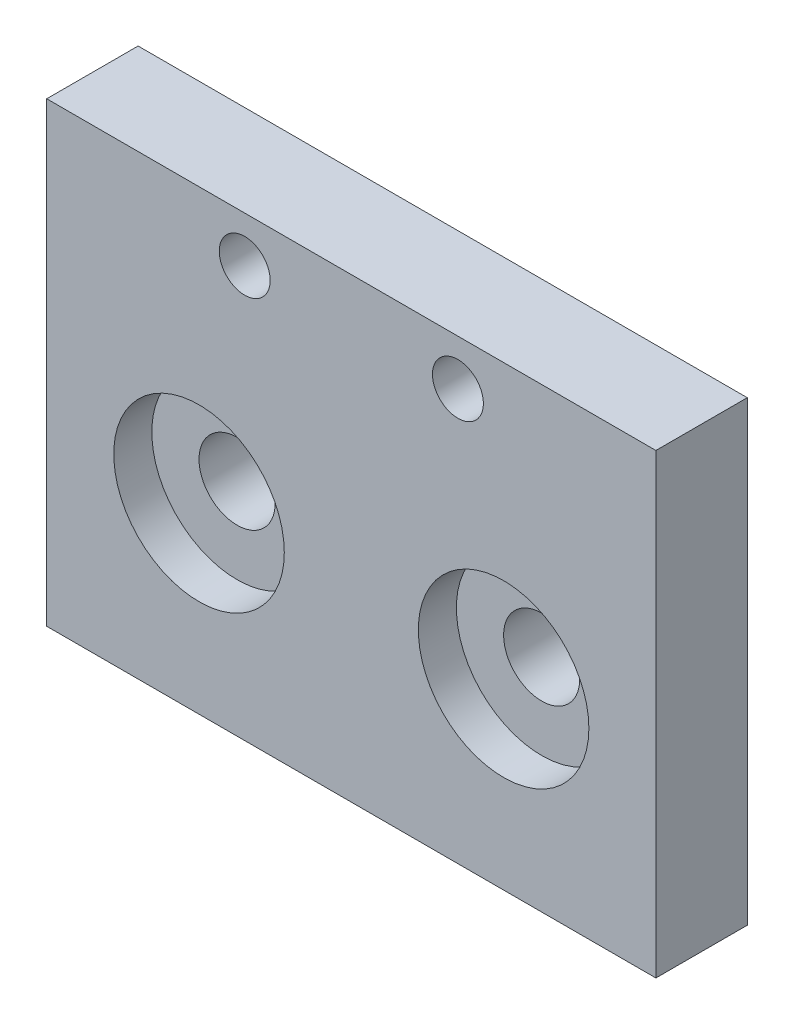
ISO-10303-21;
HEADER;
FILE_DESCRIPTION(('STEP AP214'),'2;1');
FILE_NAME('part.step','',(''),(''),'','','');
FILE_SCHEMA(('AUTOMOTIVE_DESIGN { 1 0 10303 214 1 1 1 1 }'));
ENDSEC;
DATA;
#1=APPLICATION_CONTEXT('core data for automotive mechanical design processes');
#2=APPLICATION_PROTOCOL_DEFINITION('international standard','automotive_design',2000,#1);
#3=PRODUCT_CONTEXT('',#1,'mechanical');
#4=PRODUCT('Part','Part','',(#3));
#5=PRODUCT_RELATED_PRODUCT_CATEGORY('part','',(#4));
#6=PRODUCT_DEFINITION_FORMATION('','',#4);
#7=PRODUCT_DEFINITION_CONTEXT('part definition',#1,'design');
#8=PRODUCT_DEFINITION('design','',#6,#7);
#9=PRODUCT_DEFINITION_SHAPE('','',#8);
#10=(LENGTH_UNIT() NAMED_UNIT(*) SI_UNIT(.MILLI.,.METRE.));
#11=(NAMED_UNIT(*) PLANE_ANGLE_UNIT() SI_UNIT($,.RADIAN.));
#12=(NAMED_UNIT(*) SI_UNIT($,.STERADIAN.) SOLID_ANGLE_UNIT());
#13=UNCERTAINTY_MEASURE_WITH_UNIT(LENGTH_MEASURE(1.E-05),#10,'distance_accuracy_value','');
#14=(GEOMETRIC_REPRESENTATION_CONTEXT(3) GLOBAL_UNCERTAINTY_ASSIGNED_CONTEXT((#13)) GLOBAL_UNIT_ASSIGNED_CONTEXT((#10,
#11,#12)) REPRESENTATION_CONTEXT('',''));
#15=CARTESIAN_POINT('',(0.,0.,0.));
#16=DIRECTION('',(0.,0.,1.));
#17=DIRECTION('',(1.,0.,0.));
#18=AXIS2_PLACEMENT_3D('',#15,#16,#17);
#19=CARTESIAN_POINT('',(15.875,-28.575,9.525));
#20=DIRECTION('',(0.,0.,-1.));
#21=DIRECTION('',(-1.,0.,0.));
#22=AXIS2_PLACEMENT_3D('',#19,#20,#21);
#23=CYLINDRICAL_SURFACE('',#22,3.96874999999999);
#24=CARTESIAN_POINT('',(15.875,-28.575,0.));
#25=DIRECTION('',(0.,0.,1.));
#26=DIRECTION('',(1.,0.,0.));
#27=AXIS2_PLACEMENT_3D('',#24,#25,#26);
#28=CIRCLE('',#27,3.96874999999999);
#29=CARTESIAN_POINT('',(11.90625,-28.575,0.));
#30=VERTEX_POINT('',#29);
#31=EDGE_CURVE('E150',#30,#30,#28,.F.);
#32=CARTESIAN_POINT('',(15.875,-28.575,5.55752));
#33=DIRECTION('',(0.,0.,1.));
#34=DIRECTION('',(1.,0.,0.));
#35=AXIS2_PLACEMENT_3D('',#32,#33,#34);
#36=CIRCLE('',#35,3.96874999999999);
#37=CARTESIAN_POINT('',(11.90625,-28.575,5.55752));
#38=VERTEX_POINT('',#37);
#39=EDGE_CURVE('E170',#38,#38,#36,.F.);
#40=CARTESIAN_POINT('',(11.90625,-28.575,0.));
#41=CARTESIAN_POINT('',(11.90625,-28.575,0.0578908333333332));
#42=CARTESIAN_POINT('',(11.90625,-28.575,0.115781666666666));
#43=CARTESIAN_POINT('',(11.90625,-28.575,0.231563333333333));
#44=CARTESIAN_POINT('',(11.90625,-28.575,0.289454166666667));
#45=CARTESIAN_POINT('',(11.90625,-28.575,0.405235833333334));
#46=CARTESIAN_POINT('',(11.90625,-28.575,0.463126666666667));
#47=CARTESIAN_POINT('',(11.90625,-28.575,0.578908333333333));
#48=CARTESIAN_POINT('',(11.90625,-28.575,0.636799166666666));
#49=CARTESIAN_POINT('',(11.90625,-28.575,0.752580833333333));
#50=CARTESIAN_POINT('',(11.90625,-28.575,0.810471666666667));
#51=CARTESIAN_POINT('',(11.90625,-28.575,0.926253333333334));
#52=CARTESIAN_POINT('',(11.90625,-28.575,0.984144166666667));
#53=CARTESIAN_POINT('',(11.90625,-28.575,1.09992583333333));
#54=CARTESIAN_POINT('',(11.90625,-28.575,1.15781666666667));
#55=CARTESIAN_POINT('',(11.90625,-28.575,1.27359833333333));
#56=CARTESIAN_POINT('',(11.90625,-28.575,1.33148916666667));
#57=CARTESIAN_POINT('',(11.90625,-28.575,1.44727083333333));
#58=CARTESIAN_POINT('',(11.90625,-28.575,1.50516166666667));
#59=CARTESIAN_POINT('',(11.90625,-28.575,1.62094333333333));
#60=CARTESIAN_POINT('',(11.90625,-28.575,1.67883416666667));
#61=CARTESIAN_POINT('',(11.90625,-28.575,1.79461583333333));
#62=CARTESIAN_POINT('',(11.90625,-28.575,1.85250666666667));
#63=CARTESIAN_POINT('',(11.90625,-28.575,1.96828833333333));
#64=CARTESIAN_POINT('',(11.90625,-28.575,2.02617916666667));
#65=CARTESIAN_POINT('',(11.90625,-28.575,2.14196083333333));
#66=CARTESIAN_POINT('',(11.90625,-28.575,2.19985166666667));
#67=CARTESIAN_POINT('',(11.90625,-28.575,2.31563333333333));
#68=CARTESIAN_POINT('',(11.90625,-28.575,2.37352416666667));
#69=CARTESIAN_POINT('',(11.90625,-28.575,2.48930583333333));
#70=CARTESIAN_POINT('',(11.90625,-28.575,2.54719666666667));
#71=CARTESIAN_POINT('',(11.90625,-28.575,2.66297833333333));
#72=CARTESIAN_POINT('',(11.90625,-28.575,2.72086916666667));
#73=CARTESIAN_POINT('',(11.90625,-28.575,2.83665083333333));
#74=CARTESIAN_POINT('',(11.90625,-28.575,2.89454166666667));
#75=CARTESIAN_POINT('',(11.90625,-28.575,3.01032333333333));
#76=CARTESIAN_POINT('',(11.90625,-28.575,3.06821416666667));
#77=CARTESIAN_POINT('',(11.90625,-28.575,3.18399583333333));
#78=CARTESIAN_POINT('',(11.90625,-28.575,3.24188666666667));
#79=CARTESIAN_POINT('',(11.90625,-28.575,3.35766833333333));
#80=CARTESIAN_POINT('',(11.90625,-28.575,3.41555916666667));
#81=CARTESIAN_POINT('',(11.90625,-28.575,3.53134083333333));
#82=CARTESIAN_POINT('',(11.90625,-28.575,3.58923166666667));
#83=CARTESIAN_POINT('',(11.90625,-28.575,3.70501333333333));
#84=CARTESIAN_POINT('',(11.90625,-28.575,3.76290416666667));
#85=CARTESIAN_POINT('',(11.90625,-28.575,3.87868583333333));
#86=CARTESIAN_POINT('',(11.90625,-28.575,3.93657666666667));
#87=CARTESIAN_POINT('',(11.90625,-28.575,4.05235833333333));
#88=CARTESIAN_POINT('',(11.90625,-28.575,4.11024916666667));
#89=CARTESIAN_POINT('',(11.90625,-28.575,4.22603083333333));
#90=CARTESIAN_POINT('',(11.90625,-28.575,4.28392166666667));
#91=CARTESIAN_POINT('',(11.90625,-28.575,4.39970333333333));
#92=CARTESIAN_POINT('',(11.90625,-28.575,4.45759416666667));
#93=CARTESIAN_POINT('',(11.90625,-28.575,4.57337583333333));
#94=CARTESIAN_POINT('',(11.90625,-28.575,4.63126666666667));
#95=CARTESIAN_POINT('',(11.90625,-28.575,4.74704833333333));
#96=CARTESIAN_POINT('',(11.90625,-28.575,4.80493916666667));
#97=CARTESIAN_POINT('',(11.90625,-28.575,4.92072083333333));
#98=CARTESIAN_POINT('',(11.90625,-28.575,4.97861166666667));
#99=CARTESIAN_POINT('',(11.90625,-28.575,5.09439333333333));
#100=CARTESIAN_POINT('',(11.90625,-28.575,5.15228416666667));
#101=CARTESIAN_POINT('',(11.90625,-28.575,5.26806583333333));
#102=CARTESIAN_POINT('',(11.90625,-28.575,5.32595666666667));
#103=CARTESIAN_POINT('',(11.90625,-28.575,5.44173833333333));
#104=CARTESIAN_POINT('',(11.90625,-28.575,5.49962916666667));
#105=CARTESIAN_POINT('',(11.90625,-28.575,5.55752));
#106=B_SPLINE_CURVE_WITH_KNOTS('',3,(#40,#41,#42,#43,#44,#45,#46,#47,#48,#49,#50,#51,#52,#53,
#54,#55,#56,#57,#58,#59,#60,#61,#62,#63,#64,#65,#66,#67,#68,#69,#70,#71,#72,#73,#74,#75,#76,#77,
#78,#79,#80,#81,#82,#83,#84,#85,#86,#87,#88,#89,#90,#91,#92,#93,#94,#95,#96,#97,#98,#99,#100,
#101,#102,#103,#104,#105),.UNSPECIFIED.,.F.,.F.,(4,2,2,2,2,2,2,2,2,2,2,2,2,2,2,2,2,2,2,2,2,2,2,
2,2,2,2,2,2,2,2,2,4),(0.,0.173672499999999,0.347345000000001,0.5210175,0.69469,
0.868362500000001,1.042035,1.2157075,1.38938,1.5630525,1.736725,1.9103975,2.08407,2.2577425,
2.431415,2.6050875,2.77876,2.9524325,3.126105,3.2997775,3.47345,3.6471225,3.820795,3.9944675,
4.16814,4.3418125,4.515485,4.6891575,4.86283,5.0365025,5.210175,5.3838475,5.55752),.UNSPECIFIED.);
#107=EDGE_CURVE('BSEAM67',#30,#38,#106,.T.);
#108=ORIENTED_EDGE('',*,*,#31,.T.);
#109=ORIENTED_EDGE('',*,*,#39,.F.);
#110=ORIENTED_EDGE('',*,*,#107,.T.);
#111=ORIENTED_EDGE('',*,*,#107,.F.);
#112=EDGE_LOOP('',(#108,#110,#109,#111));
#113=FACE_BOUND('',#112,.T.);
#114=ADVANCED_FACE('F67',(#113),#23,.F.);
#115=CARTESIAN_POINT('',(-15.875,-28.575,9.525));
#116=DIRECTION('',(0.,0.,-1.));
#117=DIRECTION('',(-1.,0.,0.));
#118=AXIS2_PLACEMENT_3D('',#115,#116,#117);
#119=CYLINDRICAL_SURFACE('',#118,3.96874999999999);
#120=CARTESIAN_POINT('',(-15.875,-28.575,0.));
#121=DIRECTION('',(0.,0.,1.));
#122=DIRECTION('',(1.,0.,0.));
#123=AXIS2_PLACEMENT_3D('',#120,#121,#122);
#124=CIRCLE('',#123,3.96874999999999);
#125=CARTESIAN_POINT('',(-19.84375,-28.575,0.));
#126=VERTEX_POINT('',#125);
#127=EDGE_CURVE('E153',#126,#126,#124,.T.);
#128=CARTESIAN_POINT('',(-15.875,-28.575,5.55752));
#129=DIRECTION('',(0.,0.,1.));
#130=DIRECTION('',(1.,0.,0.));
#131=AXIS2_PLACEMENT_3D('',#128,#129,#130);
#132=CIRCLE('',#131,3.96874999999999);
#133=CARTESIAN_POINT('',(-19.84375,-28.575,5.55752));
#134=VERTEX_POINT('',#133);
#135=EDGE_CURVE('E160',#134,#134,#132,.F.);
#136=CARTESIAN_POINT('',(-19.84375,-28.575,0.));
#137=CARTESIAN_POINT('',(-19.84375,-28.575,0.0578908333333332));
#138=CARTESIAN_POINT('',(-19.84375,-28.575,0.115781666666666));
#139=CARTESIAN_POINT('',(-19.84375,-28.575,0.231563333333333));
#140=CARTESIAN_POINT('',(-19.84375,-28.575,0.289454166666667));
#141=CARTESIAN_POINT('',(-19.84375,-28.575,0.405235833333334));
#142=CARTESIAN_POINT('',(-19.84375,-28.575,0.463126666666667));
#143=CARTESIAN_POINT('',(-19.84375,-28.575,0.578908333333333));
#144=CARTESIAN_POINT('',(-19.84375,-28.575,0.636799166666666));
#145=CARTESIAN_POINT('',(-19.84375,-28.575,0.752580833333333));
#146=CARTESIAN_POINT('',(-19.84375,-28.575,0.810471666666667));
#147=CARTESIAN_POINT('',(-19.84375,-28.575,0.926253333333334));
#148=CARTESIAN_POINT('',(-19.84375,-28.575,0.984144166666667));
#149=CARTESIAN_POINT('',(-19.84375,-28.575,1.09992583333333));
#150=CARTESIAN_POINT('',(-19.84375,-28.575,1.15781666666667));
#151=CARTESIAN_POINT('',(-19.84375,-28.575,1.27359833333333));
#152=CARTESIAN_POINT('',(-19.84375,-28.575,1.33148916666667));
#153=CARTESIAN_POINT('',(-19.84375,-28.575,1.44727083333333));
#154=CARTESIAN_POINT('',(-19.84375,-28.575,1.50516166666667));
#155=CARTESIAN_POINT('',(-19.84375,-28.575,1.62094333333333));
#156=CARTESIAN_POINT('',(-19.84375,-28.575,1.67883416666667));
#157=CARTESIAN_POINT('',(-19.84375,-28.575,1.79461583333333));
#158=CARTESIAN_POINT('',(-19.84375,-28.575,1.85250666666667));
#159=CARTESIAN_POINT('',(-19.84375,-28.575,1.96828833333333));
#160=CARTESIAN_POINT('',(-19.84375,-28.575,2.02617916666667));
#161=CARTESIAN_POINT('',(-19.84375,-28.575,2.14196083333333));
#162=CARTESIAN_POINT('',(-19.84375,-28.575,2.19985166666667));
#163=CARTESIAN_POINT('',(-19.84375,-28.575,2.31563333333333));
#164=CARTESIAN_POINT('',(-19.84375,-28.575,2.37352416666667));
#165=CARTESIAN_POINT('',(-19.84375,-28.575,2.48930583333333));
#166=CARTESIAN_POINT('',(-19.84375,-28.575,2.54719666666667));
#167=CARTESIAN_POINT('',(-19.84375,-28.575,2.66297833333333));
#168=CARTESIAN_POINT('',(-19.84375,-28.575,2.72086916666667));
#169=CARTESIAN_POINT('',(-19.84375,-28.575,2.83665083333333));
#170=CARTESIAN_POINT('',(-19.84375,-28.575,2.89454166666667));
#171=CARTESIAN_POINT('',(-19.84375,-28.575,3.01032333333333));
#172=CARTESIAN_POINT('',(-19.84375,-28.575,3.06821416666667));
#173=CARTESIAN_POINT('',(-19.84375,-28.575,3.18399583333333));
#174=CARTESIAN_POINT('',(-19.84375,-28.575,3.24188666666667));
#175=CARTESIAN_POINT('',(-19.84375,-28.575,3.35766833333333));
#176=CARTESIAN_POINT('',(-19.84375,-28.575,3.41555916666667));
#177=CARTESIAN_POINT('',(-19.84375,-28.575,3.53134083333333));
#178=CARTESIAN_POINT('',(-19.84375,-28.575,3.58923166666667));
#179=CARTESIAN_POINT('',(-19.84375,-28.575,3.70501333333333));
#180=CARTESIAN_POINT('',(-19.84375,-28.575,3.76290416666667));
#181=CARTESIAN_POINT('',(-19.84375,-28.575,3.87868583333333));
#182=CARTESIAN_POINT('',(-19.84375,-28.575,3.93657666666667));
#183=CARTESIAN_POINT('',(-19.84375,-28.575,4.05235833333333));
#184=CARTESIAN_POINT('',(-19.84375,-28.575,4.11024916666667));
#185=CARTESIAN_POINT('',(-19.84375,-28.575,4.22603083333333));
#186=CARTESIAN_POINT('',(-19.84375,-28.575,4.28392166666667));
#187=CARTESIAN_POINT('',(-19.84375,-28.575,4.39970333333333));
#188=CARTESIAN_POINT('',(-19.84375,-28.575,4.45759416666667));
#189=CARTESIAN_POINT('',(-19.84375,-28.575,4.57337583333333));
#190=CARTESIAN_POINT('',(-19.84375,-28.575,4.63126666666667));
#191=CARTESIAN_POINT('',(-19.84375,-28.575,4.74704833333333));
#192=CARTESIAN_POINT('',(-19.84375,-28.575,4.80493916666667));
#193=CARTESIAN_POINT('',(-19.84375,-28.575,4.92072083333333));
#194=CARTESIAN_POINT('',(-19.84375,-28.575,4.97861166666667));
#195=CARTESIAN_POINT('',(-19.84375,-28.575,5.09439333333333));
#196=CARTESIAN_POINT('',(-19.84375,-28.575,5.15228416666667));
#197=CARTESIAN_POINT('',(-19.84375,-28.575,5.26806583333333));
#198=CARTESIAN_POINT('',(-19.84375,-28.575,5.32595666666667));
#199=CARTESIAN_POINT('',(-19.84375,-28.575,5.44173833333333));
#200=CARTESIAN_POINT('',(-19.84375,-28.575,5.49962916666667));
#201=CARTESIAN_POINT('',(-19.84375,-28.575,5.55752));
#202=B_SPLINE_CURVE_WITH_KNOTS('',3,(#136,#137,#138,#139,#140,#141,#142,#143,#144,#145,#146,
#147,#148,#149,#150,#151,#152,#153,#154,#155,#156,#157,#158,#159,#160,#161,#162,#163,#164,#165,
#166,#167,#168,#169,#170,#171,#172,#173,#174,#175,#176,#177,#178,#179,#180,#181,#182,#183,#184,
#185,#186,#187,#188,#189,#190,#191,#192,#193,#194,#195,#196,#197,#198,#199,#200,#201),
.UNSPECIFIED.,.F.,.F.,(4,2,2,2,2,2,2,2,2,2,2,2,2,2,2,2,2,2,2,2,2,2,2,2,2,2,2,2,2,2,2,2,4),(0.,
0.173672499999999,0.347345000000001,0.5210175,0.69469,0.868362500000001,1.042035,1.2157075,
1.38938,1.5630525,1.736725,1.9103975,2.08407,2.2577425,2.431415,2.6050875,2.77876,2.9524325,
3.126105,3.2997775,3.47345,3.6471225,3.820795,3.9944675,4.16814,4.3418125,4.515485,4.6891575,
4.86283,5.0365025,5.210175,5.3838475,5.55752),.UNSPECIFIED.);
#203=EDGE_CURVE('BSEAM203',#126,#134,#202,.T.);
#204=ORIENTED_EDGE('',*,*,#127,.F.);
#205=ORIENTED_EDGE('',*,*,#135,.F.);
#206=ORIENTED_EDGE('',*,*,#203,.T.);
#207=ORIENTED_EDGE('',*,*,#203,.F.);
#208=EDGE_LOOP('',(#204,#206,#205,#207));
#209=FACE_BOUND('',#208,.T.);
#210=ADVANCED_FACE('F203',(#209),#119,.F.);
#211=CARTESIAN_POINT('',(31.75,0.,9.525));
#212=DIRECTION('',(1.,0.,0.));
#213=DIRECTION('',(0.,1.,0.));
#214=AXIS2_PLACEMENT_3D('',#211,#212,#213);
#215=PLANE('',#214);
#216=DIRECTION('',(0.,-1.,0.));
#217=VECTOR('',#216,1.);
#218=CARTESIAN_POINT('',(31.75,0.,0.));
#219=LINE('',#218,#217);
#220=CARTESIAN_POINT('',(31.75,0.,0.));
#221=VERTEX_POINT('',#220);
#222=CARTESIAN_POINT('',(31.75,-47.625,0.));
#223=VERTEX_POINT('',#222);
#224=EDGE_CURVE('E144',#221,#223,#219,.T.);
#225=ORIENTED_EDGE('',*,*,#224,.F.);
#226=DIRECTION('',(0.,0.,-1.));
#227=VECTOR('',#226,1.);
#228=CARTESIAN_POINT('',(31.75,0.,9.525));
#229=LINE('',#228,#227);
#230=CARTESIAN_POINT('',(31.75,0.,9.525));
#231=VERTEX_POINT('',#230);
#232=EDGE_CURVE('E13',#231,#221,#229,.T.);
#233=ORIENTED_EDGE('',*,*,#232,.F.);
#234=DIRECTION('',(0.,-1.,0.));
#235=VECTOR('',#234,1.);
#236=CARTESIAN_POINT('',(31.75,0.,9.525));
#237=LINE('',#236,#235);
#238=CARTESIAN_POINT('',(31.75,-47.625,9.525));
#239=VERTEX_POINT('',#238);
#240=EDGE_CURVE('E131',#231,#239,#237,.T.);
#241=ORIENTED_EDGE('',*,*,#240,.T.);
#242=DIRECTION('',(0.,0.,-1.));
#243=VECTOR('',#242,1.);
#244=CARTESIAN_POINT('',(31.75,-47.625,9.525));
#245=LINE('',#244,#243);
#246=EDGE_CURVE('E109',#239,#223,#245,.T.);
#247=ORIENTED_EDGE('',*,*,#246,.T.);
#248=EDGE_LOOP('',(#225,#233,#241,#247));
#249=FACE_BOUND('',#248,.T.);
#250=ADVANCED_FACE('F208',(#249),#215,.T.);
#251=CARTESIAN_POINT('',(0.,0.,9.525));
#252=DIRECTION('',(0.,1.,0.));
#253=DIRECTION('',(-1.,0.,0.));
#254=AXIS2_PLACEMENT_3D('',#251,#252,#253);
#255=PLANE('',#254);
#256=DIRECTION('',(1.,0.,0.));
#257=VECTOR('',#256,1.);
#258=CARTESIAN_POINT('',(0.,0.,0.));
#259=LINE('',#258,#257);
#260=CARTESIAN_POINT('',(-31.75,0.,0.));
#261=VERTEX_POINT('',#260);
#262=EDGE_CURVE('E121',#261,#221,#259,.T.);
#263=ORIENTED_EDGE('',*,*,#262,.F.);
#264=DIRECTION('',(0.,0.,-1.));
#265=VECTOR('',#264,1.);
#266=CARTESIAN_POINT('',(-31.75,0.,9.525));
#267=LINE('',#266,#265);
#268=CARTESIAN_POINT('',(-31.75,0.,9.525));
#269=VERTEX_POINT('',#268);
#270=EDGE_CURVE('E77',#269,#261,#267,.T.);
#271=ORIENTED_EDGE('',*,*,#270,.F.);
#272=DIRECTION('',(1.,0.,0.));
#273=VECTOR('',#272,1.);
#274=CARTESIAN_POINT('',(0.,0.,9.525));
#275=LINE('',#274,#273);
#276=EDGE_CURVE('E119',#269,#231,#275,.T.);
#277=ORIENTED_EDGE('',*,*,#276,.T.);
#278=ORIENTED_EDGE('',*,*,#232,.T.);
#279=EDGE_LOOP('',(#263,#271,#277,#278));
#280=FACE_BOUND('',#279,.T.);
#281=ADVANCED_FACE('F117',(#280),#255,.T.);
#282=CARTESIAN_POINT('',(-31.75,0.,9.525));
#283=DIRECTION('',(1.,0.,0.));
#284=DIRECTION('',(0.,1.,0.));
#285=AXIS2_PLACEMENT_3D('',#282,#283,#284);
#286=PLANE('',#285);
#287=DIRECTION('',(0.,-1.,0.));
#288=VECTOR('',#287,1.);
#289=CARTESIAN_POINT('',(-31.75,0.,0.));
#290=LINE('',#289,#288);
#291=CARTESIAN_POINT('',(-31.75,-47.625,0.));
#292=VERTEX_POINT('',#291);
#293=EDGE_CURVE('E147',#261,#292,#290,.T.);
#294=ORIENTED_EDGE('',*,*,#293,.T.);
#295=DIRECTION('',(0.,0.,-1.));
#296=VECTOR('',#295,1.);
#297=CARTESIAN_POINT('',(-31.75,-47.625,9.525));
#298=LINE('',#297,#296);
#299=CARTESIAN_POINT('',(-31.75,-47.625,9.525));
#300=VERTEX_POINT('',#299);
#301=EDGE_CURVE('E124',#300,#292,#298,.T.);
#302=ORIENTED_EDGE('',*,*,#301,.F.);
#303=DIRECTION('',(0.,-1.,0.));
#304=VECTOR('',#303,1.);
#305=CARTESIAN_POINT('',(-31.75,0.,9.525));
#306=LINE('',#305,#304);
#307=EDGE_CURVE('E127',#269,#300,#306,.T.);
#308=ORIENTED_EDGE('',*,*,#307,.F.);
#309=ORIENTED_EDGE('',*,*,#270,.T.);
#310=EDGE_LOOP('',(#294,#302,#308,#309));
#311=FACE_BOUND('',#310,.T.);
#312=ADVANCED_FACE('F128',(#311),#286,.F.);
#313=CARTESIAN_POINT('',(0.,-47.625,9.525));
#314=DIRECTION('',(0.,1.,0.));
#315=DIRECTION('',(0.,0.,1.));
#316=AXIS2_PLACEMENT_3D('',#313,#314,#315);
#317=PLANE('',#316);
#318=DIRECTION('',(1.,0.,0.));
#319=VECTOR('',#318,1.);
#320=CARTESIAN_POINT('',(0.,-47.625,0.));
#321=LINE('',#320,#319);
#322=EDGE_CURVE('E102',#292,#223,#321,.T.);
#323=ORIENTED_EDGE('',*,*,#322,.T.);
#324=ORIENTED_EDGE('',*,*,#246,.F.);
#325=DIRECTION('',(1.,0.,0.));
#326=VECTOR('',#325,1.);
#327=CARTESIAN_POINT('',(0.,-47.625,9.525));
#328=LINE('',#327,#326);
#329=EDGE_CURVE('E86',#300,#239,#328,.T.);
#330=ORIENTED_EDGE('',*,*,#329,.F.);
#331=ORIENTED_EDGE('',*,*,#301,.T.);
#332=EDGE_LOOP('',(#323,#324,#330,#331));
#333=FACE_BOUND('',#332,.T.);
#334=ADVANCED_FACE('F213',(#333),#317,.F.);
#335=CARTESIAN_POINT('',(-11.1125,-4.76250000000001,9.525));
#336=DIRECTION('',(0.,0.,-1.));
#337=DIRECTION('',(-1.,0.,0.));
#338=AXIS2_PLACEMENT_3D('',#335,#336,#337);
#339=CYLINDRICAL_SURFACE('',#338,2.6543);
#340=CARTESIAN_POINT('',(-11.1125,-4.76250000000001,9.525));
#341=DIRECTION('',(0.,0.,1.));
#342=DIRECTION('',(1.,0.,0.));
#343=AXIS2_PLACEMENT_3D('',#340,#341,#342);
#344=CIRCLE('',#343,2.6543);
#345=CARTESIAN_POINT('',(-13.7668,-4.76250000000001,9.525));
#346=VERTEX_POINT('',#345);
#347=EDGE_CURVE('E133',#346,#346,#344,.T.);
#348=CARTESIAN_POINT('',(-11.1125,-4.76250000000001,0.));
#349=DIRECTION('',(0.,0.,1.));
#350=DIRECTION('',(1.,0.,0.));
#351=AXIS2_PLACEMENT_3D('',#348,#349,#350);
#352=CIRCLE('',#351,2.6543);
#353=CARTESIAN_POINT('',(-13.7668,-4.76250000000001,0.));
#354=VERTEX_POINT('',#353);
#355=EDGE_CURVE('E141',#354,#354,#352,.T.);
#356=CARTESIAN_POINT('',(-13.7668,-4.76250000000001,9.525));
#357=CARTESIAN_POINT('',(-13.7668,-4.76250000000001,9.42578125));
#358=CARTESIAN_POINT('',(-13.7668,-4.76250000000001,9.3265625));
#359=CARTESIAN_POINT('',(-13.7668,-4.76250000000001,9.128125));
#360=CARTESIAN_POINT('',(-13.7668,-4.76250000000001,9.02890625));
#361=CARTESIAN_POINT('',(-13.7668,-4.76250000000001,8.83046875));
#362=CARTESIAN_POINT('',(-13.7668,-4.76250000000001,8.73125));
#363=CARTESIAN_POINT('',(-13.7668,-4.76250000000001,8.5328125));
#364=CARTESIAN_POINT('',(-13.7668,-4.76250000000001,8.43359375));
#365=CARTESIAN_POINT('',(-13.7668,-4.76250000000001,8.23515625));
#366=CARTESIAN_POINT('',(-13.7668,-4.76250000000001,8.1359375));
#367=CARTESIAN_POINT('',(-13.7668,-4.76250000000001,7.9375));
#368=CARTESIAN_POINT('',(-13.7668,-4.76250000000001,7.83828125));
#369=CARTESIAN_POINT('',(-13.7668,-4.76250000000001,7.63984375));
#370=CARTESIAN_POINT('',(-13.7668,-4.76250000000001,7.540625));
#371=CARTESIAN_POINT('',(-13.7668,-4.76250000000001,7.3421875));
#372=CARTESIAN_POINT('',(-13.7668,-4.76250000000001,7.24296875));
#373=CARTESIAN_POINT('',(-13.7668,-4.76250000000001,7.04453125));
#374=CARTESIAN_POINT('',(-13.7668,-4.76250000000001,6.9453125));
#375=CARTESIAN_POINT('',(-13.7668,-4.76250000000001,6.746875));
#376=CARTESIAN_POINT('',(-13.7668,-4.76250000000001,6.64765625));
#377=CARTESIAN_POINT('',(-13.7668,-4.76250000000001,6.44921875));
#378=CARTESIAN_POINT('',(-13.7668,-4.76250000000001,6.35));
#379=CARTESIAN_POINT('',(-13.7668,-4.76250000000001,6.1515625));
#380=CARTESIAN_POINT('',(-13.7668,-4.76250000000001,6.05234375));
#381=CARTESIAN_POINT('',(-13.7668,-4.76250000000001,5.85390625));
#382=CARTESIAN_POINT('',(-13.7668,-4.76250000000001,5.7546875));
#383=CARTESIAN_POINT('',(-13.7668,-4.76250000000001,5.55625));
#384=CARTESIAN_POINT('',(-13.7668,-4.76250000000001,5.45703125));
#385=CARTESIAN_POINT('',(-13.7668,-4.76250000000001,5.25859375));
#386=CARTESIAN_POINT('',(-13.7668,-4.76250000000001,5.159375));
#387=CARTESIAN_POINT('',(-13.7668,-4.76250000000001,4.9609375));
#388=CARTESIAN_POINT('',(-13.7668,-4.76250000000001,4.86171875));
#389=CARTESIAN_POINT('',(-13.7668,-4.76250000000001,4.66328125));
#390=CARTESIAN_POINT('',(-13.7668,-4.76250000000001,4.5640625));
#391=CARTESIAN_POINT('',(-13.7668,-4.76250000000001,4.365625));
#392=CARTESIAN_POINT('',(-13.7668,-4.76250000000001,4.26640625));
#393=CARTESIAN_POINT('',(-13.7668,-4.76250000000001,4.06796875));
#394=CARTESIAN_POINT('',(-13.7668,-4.76250000000001,3.96875));
#395=CARTESIAN_POINT('',(-13.7668,-4.76250000000001,3.7703125));
#396=CARTESIAN_POINT('',(-13.7668,-4.76250000000001,3.67109375));
#397=CARTESIAN_POINT('',(-13.7668,-4.76250000000001,3.47265625));
#398=CARTESIAN_POINT('',(-13.7668,-4.76250000000001,3.3734375));
#399=CARTESIAN_POINT('',(-13.7668,-4.76250000000001,3.175));
#400=CARTESIAN_POINT('',(-13.7668,-4.76250000000001,3.07578125));
#401=CARTESIAN_POINT('',(-13.7668,-4.76250000000001,2.87734375));
#402=CARTESIAN_POINT('',(-13.7668,-4.76250000000001,2.778125));
#403=CARTESIAN_POINT('',(-13.7668,-4.76250000000001,2.5796875));
#404=CARTESIAN_POINT('',(-13.7668,-4.76250000000001,2.48046875));
#405=CARTESIAN_POINT('',(-13.7668,-4.76250000000001,2.28203125));
#406=CARTESIAN_POINT('',(-13.7668,-4.76250000000001,2.1828125));
#407=CARTESIAN_POINT('',(-13.7668,-4.76250000000001,1.984375));
#408=CARTESIAN_POINT('',(-13.7668,-4.76250000000001,1.88515625));
#409=CARTESIAN_POINT('',(-13.7668,-4.76250000000001,1.68671875));
#410=CARTESIAN_POINT('',(-13.7668,-4.76250000000001,1.5875));
#411=CARTESIAN_POINT('',(-13.7668,-4.76250000000001,1.3890625));
#412=CARTESIAN_POINT('',(-13.7668,-4.76250000000001,1.28984375));
#413=CARTESIAN_POINT('',(-13.7668,-4.76250000000001,1.09140625));
#414=CARTESIAN_POINT('',(-13.7668,-4.76250000000001,0.992187500000001));
#415=CARTESIAN_POINT('',(-13.7668,-4.76250000000001,0.793750000000001));
#416=CARTESIAN_POINT('',(-13.7668,-4.76250000000001,0.69453125));
#417=CARTESIAN_POINT('',(-13.7668,-4.76250000000001,0.49609375));
#418=CARTESIAN_POINT('',(-13.7668,-4.76250000000001,0.396875));
#419=CARTESIAN_POINT('',(-13.7668,-4.76250000000001,0.1984375));
#420=CARTESIAN_POINT('',(-13.7668,-4.76250000000001,0.0992187500000001));
#421=CARTESIAN_POINT('',(-13.7668,-4.76250000000001,0.));
#422=B_SPLINE_CURVE_WITH_KNOTS('',3,(#356,#357,#358,#359,#360,#361,#362,#363,#364,#365,#366,
#367,#368,#369,#370,#371,#372,#373,#374,#375,#376,#377,#378,#379,#380,#381,#382,#383,#384,#385,
#386,#387,#388,#389,#390,#391,#392,#393,#394,#395,#396,#397,#398,#399,#400,#401,#402,#403,#404,
#405,#406,#407,#408,#409,#410,#411,#412,#413,#414,#415,#416,#417,#418,#419,#420,#421),
.UNSPECIFIED.,.F.,.F.,(4,2,2,2,2,2,2,2,2,2,2,2,2,2,2,2,2,2,2,2,2,2,2,2,2,2,2,2,2,2,2,2,4),(0.,
0.29765625,0.5953125,0.892968750000001,1.190625,1.48828125,1.7859375,2.08359375,2.38125,
2.67890625,2.9765625,3.27421875,3.571875,3.86953125,4.1671875,4.46484375,4.7625,5.06015625,
5.3578125,5.65546875,5.953125,6.25078125,6.5484375,6.84609375,7.14375,7.44140625,7.7390625,
8.03671875,8.334375,8.63203125,8.9296875,9.22734375,9.525),.UNSPECIFIED.);
#423=EDGE_CURVE('BSEAM182',#346,#354,#422,.T.);
#424=ORIENTED_EDGE('',*,*,#347,.T.);
#425=ORIENTED_EDGE('',*,*,#355,.F.);
#426=ORIENTED_EDGE('',*,*,#423,.T.);
#427=ORIENTED_EDGE('',*,*,#423,.F.);
#428=EDGE_LOOP('',(#424,#426,#425,#427));
#429=FACE_BOUND('',#428,.T.);
#430=ADVANCED_FACE('F182',(#429),#339,.F.);
#431=CARTESIAN_POINT('',(11.1125,-4.76250000000001,9.525));
#432=DIRECTION('',(0.,0.,-1.));
#433=DIRECTION('',(-1.,0.,0.));
#434=AXIS2_PLACEMENT_3D('',#431,#432,#433);
#435=CYLINDRICAL_SURFACE('',#434,2.6543);
#436=CARTESIAN_POINT('',(11.1125,-4.76250000000001,9.525));
#437=DIRECTION('',(0.,0.,1.));
#438=DIRECTION('',(1.,0.,0.));
#439=AXIS2_PLACEMENT_3D('',#436,#437,#438);
#440=CIRCLE('',#439,2.6543);
#441=CARTESIAN_POINT('',(8.4582,-4.76250000000001,9.525));
#442=VERTEX_POINT('',#441);
#443=EDGE_CURVE('E156',#442,#442,#440,.T.);
#444=CARTESIAN_POINT('',(11.1125,-4.76250000000001,0.));
#445=DIRECTION('',(0.,0.,1.));
#446=DIRECTION('',(1.,0.,0.));
#447=AXIS2_PLACEMENT_3D('',#444,#445,#446);
#448=CIRCLE('',#447,2.6543);
#449=CARTESIAN_POINT('',(8.4582,-4.76250000000001,0.));
#450=VERTEX_POINT('',#449);
#451=EDGE_CURVE('E138',#450,#450,#448,.T.);
#452=CARTESIAN_POINT('',(8.4582,-4.76250000000001,9.525));
#453=CARTESIAN_POINT('',(8.4582,-4.76250000000001,9.42578125));
#454=CARTESIAN_POINT('',(8.4582,-4.76250000000001,9.3265625));
#455=CARTESIAN_POINT('',(8.4582,-4.76250000000001,9.128125));
#456=CARTESIAN_POINT('',(8.4582,-4.76250000000001,9.02890625));
#457=CARTESIAN_POINT('',(8.4582,-4.76250000000001,8.83046875));
#458=CARTESIAN_POINT('',(8.4582,-4.76250000000001,8.73125));
#459=CARTESIAN_POINT('',(8.4582,-4.76250000000001,8.5328125));
#460=CARTESIAN_POINT('',(8.4582,-4.76250000000001,8.43359375));
#461=CARTESIAN_POINT('',(8.4582,-4.76250000000001,8.23515625));
#462=CARTESIAN_POINT('',(8.4582,-4.76250000000001,8.1359375));
#463=CARTESIAN_POINT('',(8.4582,-4.76250000000001,7.9375));
#464=CARTESIAN_POINT('',(8.4582,-4.76250000000001,7.83828125));
#465=CARTESIAN_POINT('',(8.4582,-4.76250000000001,7.63984375));
#466=CARTESIAN_POINT('',(8.4582,-4.76250000000001,7.540625));
#467=CARTESIAN_POINT('',(8.4582,-4.76250000000001,7.3421875));
#468=CARTESIAN_POINT('',(8.4582,-4.76250000000001,7.24296875));
#469=CARTESIAN_POINT('',(8.4582,-4.76250000000001,7.04453125));
#470=CARTESIAN_POINT('',(8.4582,-4.76250000000001,6.9453125));
#471=CARTESIAN_POINT('',(8.4582,-4.76250000000001,6.746875));
#472=CARTESIAN_POINT('',(8.4582,-4.76250000000001,6.64765625));
#473=CARTESIAN_POINT('',(8.4582,-4.76250000000001,6.44921875));
#474=CARTESIAN_POINT('',(8.4582,-4.76250000000001,6.35));
#475=CARTESIAN_POINT('',(8.4582,-4.76250000000001,6.1515625));
#476=CARTESIAN_POINT('',(8.4582,-4.76250000000001,6.05234375));
#477=CARTESIAN_POINT('',(8.4582,-4.76250000000001,5.85390625));
#478=CARTESIAN_POINT('',(8.4582,-4.76250000000001,5.7546875));
#479=CARTESIAN_POINT('',(8.4582,-4.76250000000001,5.55625));
#480=CARTESIAN_POINT('',(8.4582,-4.76250000000001,5.45703125));
#481=CARTESIAN_POINT('',(8.4582,-4.76250000000001,5.25859375));
#482=CARTESIAN_POINT('',(8.4582,-4.76250000000001,5.159375));
#483=CARTESIAN_POINT('',(8.4582,-4.76250000000001,4.9609375));
#484=CARTESIAN_POINT('',(8.4582,-4.76250000000001,4.86171875));
#485=CARTESIAN_POINT('',(8.4582,-4.76250000000001,4.66328125));
#486=CARTESIAN_POINT('',(8.4582,-4.76250000000001,4.5640625));
#487=CARTESIAN_POINT('',(8.4582,-4.76250000000001,4.365625));
#488=CARTESIAN_POINT('',(8.4582,-4.76250000000001,4.26640625));
#489=CARTESIAN_POINT('',(8.4582,-4.76250000000001,4.06796875));
#490=CARTESIAN_POINT('',(8.4582,-4.76250000000001,3.96875));
#491=CARTESIAN_POINT('',(8.4582,-4.76250000000001,3.7703125));
#492=CARTESIAN_POINT('',(8.4582,-4.76250000000001,3.67109375));
#493=CARTESIAN_POINT('',(8.4582,-4.76250000000001,3.47265625));
#494=CARTESIAN_POINT('',(8.4582,-4.76250000000001,3.3734375));
#495=CARTESIAN_POINT('',(8.4582,-4.76250000000001,3.175));
#496=CARTESIAN_POINT('',(8.4582,-4.76250000000001,3.07578125));
#497=CARTESIAN_POINT('',(8.4582,-4.76250000000001,2.87734375));
#498=CARTESIAN_POINT('',(8.4582,-4.76250000000001,2.778125));
#499=CARTESIAN_POINT('',(8.4582,-4.76250000000001,2.5796875));
#500=CARTESIAN_POINT('',(8.4582,-4.76250000000001,2.48046875));
#501=CARTESIAN_POINT('',(8.4582,-4.76250000000001,2.28203125));
#502=CARTESIAN_POINT('',(8.4582,-4.76250000000001,2.1828125));
#503=CARTESIAN_POINT('',(8.4582,-4.76250000000001,1.984375));
#504=CARTESIAN_POINT('',(8.4582,-4.76250000000001,1.88515625));
#505=CARTESIAN_POINT('',(8.4582,-4.76250000000001,1.68671875));
#506=CARTESIAN_POINT('',(8.4582,-4.76250000000001,1.5875));
#507=CARTESIAN_POINT('',(8.4582,-4.76250000000001,1.3890625));
#508=CARTESIAN_POINT('',(8.4582,-4.76250000000001,1.28984375));
#509=CARTESIAN_POINT('',(8.4582,-4.76250000000001,1.09140625));
#510=CARTESIAN_POINT('',(8.4582,-4.76250000000001,0.992187500000001));
#511=CARTESIAN_POINT('',(8.4582,-4.76250000000001,0.793750000000001));
#512=CARTESIAN_POINT('',(8.4582,-4.76250000000001,0.69453125));
#513=CARTESIAN_POINT('',(8.4582,-4.76250000000001,0.49609375));
#514=CARTESIAN_POINT('',(8.4582,-4.76250000000001,0.396875));
#515=CARTESIAN_POINT('',(8.4582,-4.76250000000001,0.1984375));
#516=CARTESIAN_POINT('',(8.4582,-4.76250000000001,0.0992187500000001));
#517=CARTESIAN_POINT('',(8.4582,-4.76250000000001,0.));
#518=B_SPLINE_CURVE_WITH_KNOTS('',3,(#452,#453,#454,#455,#456,#457,#458,#459,#460,#461,#462,
#463,#464,#465,#466,#467,#468,#469,#470,#471,#472,#473,#474,#475,#476,#477,#478,#479,#480,#481,
#482,#483,#484,#485,#486,#487,#488,#489,#490,#491,#492,#493,#494,#495,#496,#497,#498,#499,#500,
#501,#502,#503,#504,#505,#506,#507,#508,#509,#510,#511,#512,#513,#514,#515,#516,#517),
.UNSPECIFIED.,.F.,.F.,(4,2,2,2,2,2,2,2,2,2,2,2,2,2,2,2,2,2,2,2,2,2,2,2,2,2,2,2,2,2,2,2,4),(0.,
0.29765625,0.5953125,0.892968750000001,1.190625,1.48828125,1.7859375,2.08359375,2.38125,
2.67890625,2.9765625,3.27421875,3.571875,3.86953125,4.1671875,4.46484375,4.7625,5.06015625,
5.3578125,5.65546875,5.953125,6.25078125,6.5484375,6.84609375,7.14375,7.44140625,7.7390625,
8.03671875,8.334375,8.63203125,8.9296875,9.22734375,9.525),.UNSPECIFIED.);
#519=EDGE_CURVE('BSEAM69',#442,#450,#518,.T.);
#520=ORIENTED_EDGE('',*,*,#443,.T.);
#521=ORIENTED_EDGE('',*,*,#451,.F.);
#522=ORIENTED_EDGE('',*,*,#519,.T.);
#523=ORIENTED_EDGE('',*,*,#519,.F.);
#524=EDGE_LOOP('',(#520,#522,#521,#523));
#525=FACE_BOUND('',#524,.T.);
#526=ADVANCED_FACE('F69',(#525),#435,.F.);
#527=CARTESIAN_POINT('',(0.,0.,9.525));
#528=DIRECTION('',(0.,0.,1.));
#529=DIRECTION('',(1.,0.,0.));
#530=AXIS2_PLACEMENT_3D('',#527,#528,#529);
#531=PLANE('',#530);
#532=CARTESIAN_POINT('',(-15.875,-28.575,9.525));
#533=DIRECTION('',(0.,0.,1.));
#534=DIRECTION('',(1.,0.,0.));
#535=AXIS2_PLACEMENT_3D('',#532,#533,#534);
#536=CIRCLE('',#535,8.89000000000001);
#537=CARTESIAN_POINT('',(-6.98499999999999,-28.575,9.525));
#538=VERTEX_POINT('',#537);
#539=EDGE_CURVE('E71',#538,#538,#536,.T.);
#540=ORIENTED_EDGE('',*,*,#539,.F.);
#541=EDGE_LOOP('',(#540));
#542=FACE_BOUND('',#541,.T.);
#543=CARTESIAN_POINT('',(15.875,-28.575,9.525));
#544=DIRECTION('',(0.,0.,1.));
#545=DIRECTION('',(1.,0.,0.));
#546=AXIS2_PLACEMENT_3D('',#543,#544,#545);
#547=CIRCLE('',#546,8.89000000000001);
#548=CARTESIAN_POINT('',(24.765,-28.575,9.525));
#549=VERTEX_POINT('',#548);
#550=EDGE_CURVE('E158',#549,#549,#547,.T.);
#551=ORIENTED_EDGE('',*,*,#550,.F.);
#552=EDGE_LOOP('',(#551));
#553=FACE_BOUND('',#552,.T.);
#554=ORIENTED_EDGE('',*,*,#443,.F.);
#555=EDGE_LOOP('',(#554));
#556=FACE_BOUND('',#555,.T.);
#557=ORIENTED_EDGE('',*,*,#347,.F.);
#558=EDGE_LOOP('',(#557));
#559=FACE_BOUND('',#558,.T.);
#560=ORIENTED_EDGE('',*,*,#240,.F.);
#561=ORIENTED_EDGE('',*,*,#276,.F.);
#562=ORIENTED_EDGE('',*,*,#307,.T.);
#563=ORIENTED_EDGE('',*,*,#329,.T.);
#564=EDGE_LOOP('',(#560,#561,#562,#563));
#565=FACE_BOUND('',#564,.T.);
#566=ADVANCED_FACE('F130',(#542,#553,#556,#559,#565),#531,.T.);
#567=CARTESIAN_POINT('',(0.,0.,0.));
#568=DIRECTION('',(0.,0.,1.));
#569=DIRECTION('',(1.,0.,0.));
#570=AXIS2_PLACEMENT_3D('',#567,#568,#569);
#571=PLANE('',#570);
#572=ORIENTED_EDGE('',*,*,#451,.T.);
#573=EDGE_LOOP('',(#572));
#574=FACE_BOUND('',#573,.T.);
#575=ORIENTED_EDGE('',*,*,#355,.T.);
#576=EDGE_LOOP('',(#575));
#577=FACE_BOUND('',#576,.T.);
#578=ORIENTED_EDGE('',*,*,#224,.T.);
#579=ORIENTED_EDGE('',*,*,#322,.F.);
#580=ORIENTED_EDGE('',*,*,#293,.F.);
#581=ORIENTED_EDGE('',*,*,#262,.T.);
#582=EDGE_LOOP('',(#578,#579,#580,#581));
#583=FACE_BOUND('',#582,.T.);
#584=ORIENTED_EDGE('',*,*,#31,.F.);
#585=EDGE_LOOP('',(#584));
#586=FACE_BOUND('',#585,.T.);
#587=ORIENTED_EDGE('',*,*,#127,.T.);
#588=EDGE_LOOP('',(#587));
#589=FACE_BOUND('',#588,.T.);
#590=ADVANCED_FACE('F186',(#574,#577,#583,#586,#589),#571,.F.);
#591=CARTESIAN_POINT('',(15.875,-28.575,-25.1447171389937));
#592=DIRECTION('',(0.,0.,1.));
#593=DIRECTION('',(1.,0.,0.));
#594=AXIS2_PLACEMENT_3D('',#591,#592,#593);
#595=CYLINDRICAL_SURFACE('',#594,8.89000000000001);
#596=ORIENTED_EDGE('',*,*,#550,.T.);
#597=EDGE_LOOP('',(#596));
#598=FACE_BOUND('',#597,.T.);
#599=CARTESIAN_POINT('',(15.875,-28.575,5.55752));
#600=DIRECTION('',(0.,0.,1.));
#601=DIRECTION('',(1.,0.,0.));
#602=AXIS2_PLACEMENT_3D('',#599,#600,#601);
#603=CIRCLE('',#602,8.89000000000001);
#604=CARTESIAN_POINT('',(24.765,-28.575,5.55752));
#605=VERTEX_POINT('',#604);
#606=EDGE_CURVE('E173',#605,#605,#603,.F.);
#607=ORIENTED_EDGE('',*,*,#606,.T.);
#608=EDGE_LOOP('',(#607));
#609=FACE_BOUND('',#608,.T.);
#610=ADVANCED_FACE('F194',(#598,#609),#595,.F.);
#611=CARTESIAN_POINT('',(0.,0.,5.55752));
#612=DIRECTION('',(0.,0.,1.));
#613=DIRECTION('',(1.,0.,0.));
#614=AXIS2_PLACEMENT_3D('',#611,#612,#613);
#615=PLANE('',#614);
#616=ORIENTED_EDGE('',*,*,#606,.F.);
#617=EDGE_LOOP('',(#616));
#618=FACE_BOUND('',#617,.T.);
#619=ORIENTED_EDGE('',*,*,#39,.T.);
#620=EDGE_LOOP('',(#619));
#621=FACE_BOUND('',#620,.T.);
#622=ADVANCED_FACE('F259',(#618,#621),#615,.T.);
#623=CARTESIAN_POINT('',(-15.875,-28.575,-25.1447171389937));
#624=DIRECTION('',(0.,0.,1.));
#625=DIRECTION('',(1.,0.,0.));
#626=AXIS2_PLACEMENT_3D('',#623,#624,#625);
#627=CYLINDRICAL_SURFACE('',#626,8.89000000000001);
#628=ORIENTED_EDGE('',*,*,#539,.T.);
#629=EDGE_LOOP('',(#628));
#630=FACE_BOUND('',#629,.T.);
#631=CARTESIAN_POINT('',(-15.875,-28.575,5.55752));
#632=DIRECTION('',(0.,0.,1.));
#633=DIRECTION('',(1.,0.,0.));
#634=AXIS2_PLACEMENT_3D('',#631,#632,#633);
#635=CIRCLE('',#634,8.89000000000001);
#636=CARTESIAN_POINT('',(-6.98499999999999,-28.575,5.55752));
#637=VERTEX_POINT('',#636);
#638=EDGE_CURVE('E165',#637,#637,#635,.F.);
#639=ORIENTED_EDGE('',*,*,#638,.T.);
#640=EDGE_LOOP('',(#639));
#641=FACE_BOUND('',#640,.T.);
#642=ADVANCED_FACE('F267',(#630,#641),#627,.F.);
#643=CARTESIAN_POINT('',(0.,0.,5.55752));
#644=DIRECTION('',(0.,0.,1.));
#645=DIRECTION('',(1.,0.,0.));
#646=AXIS2_PLACEMENT_3D('',#643,#644,#645);
#647=PLANE('',#646);
#648=ORIENTED_EDGE('',*,*,#638,.F.);
#649=EDGE_LOOP('',(#648));
#650=FACE_BOUND('',#649,.T.);
#651=ORIENTED_EDGE('',*,*,#135,.T.);
#652=EDGE_LOOP('',(#651));
#653=FACE_BOUND('',#652,.T.);
#654=ADVANCED_FACE('F277',(#650,#653),#647,.T.);
#655=CLOSED_SHELL('',(#114,#210,#250,#281,#312,#334,#430,#526,#566,#590,#610,#622,#642,#654));
#656=MANIFOLD_SOLID_BREP('B2',#655);
#657=ADVANCED_BREP_SHAPE_REPRESENTATION('',(#18,#656),#14);
#658=SHAPE_DEFINITION_REPRESENTATION(#9,#657);
ENDSEC;
END-ISO-10303-21;
